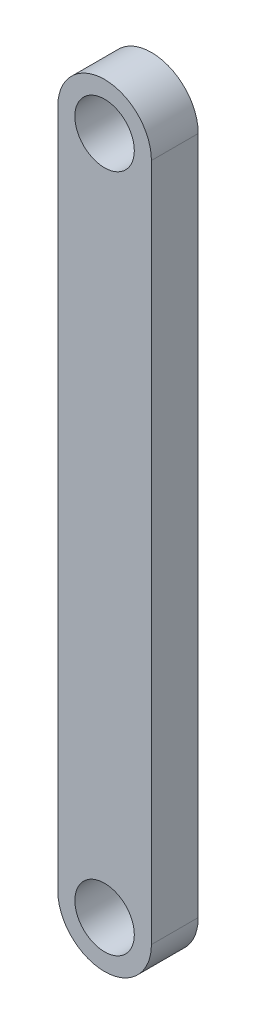
ISO-10303-21;
HEADER;
FILE_DESCRIPTION(('STEP AP214'),'2;1');
FILE_NAME('part.step','',(''),(''),'','','');
FILE_SCHEMA(('AUTOMOTIVE_DESIGN { 1 0 10303 214 1 1 1 1 }'));
ENDSEC;
DATA;
#1=APPLICATION_CONTEXT('core data for automotive mechanical design processes');
#2=APPLICATION_PROTOCOL_DEFINITION('international standard','automotive_design',2000,#1);
#3=PRODUCT_CONTEXT('',#1,'mechanical');
#4=PRODUCT('Part','Part','',(#3));
#5=PRODUCT_RELATED_PRODUCT_CATEGORY('part','',(#4));
#6=PRODUCT_DEFINITION_FORMATION('','',#4);
#7=PRODUCT_DEFINITION_CONTEXT('part definition',#1,'design');
#8=PRODUCT_DEFINITION('design','',#6,#7);
#9=PRODUCT_DEFINITION_SHAPE('','',#8);
#10=(LENGTH_UNIT() NAMED_UNIT(*) SI_UNIT(.MILLI.,.METRE.));
#11=(NAMED_UNIT(*) PLANE_ANGLE_UNIT() SI_UNIT($,.RADIAN.));
#12=(NAMED_UNIT(*) SI_UNIT($,.STERADIAN.) SOLID_ANGLE_UNIT());
#13=UNCERTAINTY_MEASURE_WITH_UNIT(LENGTH_MEASURE(1.E-05),#10,'distance_accuracy_value','');
#14=(GEOMETRIC_REPRESENTATION_CONTEXT(3) GLOBAL_UNCERTAINTY_ASSIGNED_CONTEXT((#13)) GLOBAL_UNIT_ASSIGNED_CONTEXT((#10,
#11,#12)) REPRESENTATION_CONTEXT('',''));
#15=CARTESIAN_POINT('',(0.,0.,0.));
#16=DIRECTION('',(0.,0.,1.));
#17=DIRECTION('',(1.,0.,0.));
#18=AXIS2_PLACEMENT_3D('',#15,#16,#17);
#19=CARTESIAN_POINT('',(0.,0.,10.));
#20=DIRECTION('',(0.,0.,-1.));
#21=DIRECTION('',(-1.,0.,0.));
#22=AXIS2_PLACEMENT_3D('',#19,#20,#21);
#23=CYLINDRICAL_SURFACE('',#22,10.);
#24=CARTESIAN_POINT('',(0.,0.,0.));
#25=DIRECTION('',(0.,0.,1.));
#26=DIRECTION('',(1.,0.,0.));
#27=AXIS2_PLACEMENT_3D('',#24,#25,#26);
#28=CIRCLE('',#27,10.);
#29=CARTESIAN_POINT('',(-10.,0.,0.));
#30=VERTEX_POINT('',#29);
#31=CARTESIAN_POINT('',(10.,0.,0.));
#32=VERTEX_POINT('',#31);
#33=EDGE_CURVE('E96',#30,#32,#28,.T.);
#34=ORIENTED_EDGE('',*,*,#33,.T.);
#35=DIRECTION('',(0.,0.,-1.));
#36=VECTOR('',#35,1.);
#37=CARTESIAN_POINT('',(10.,0.,10.));
#38=LINE('',#37,#36);
#39=CARTESIAN_POINT('',(10.,0.,10.));
#40=VERTEX_POINT('',#39);
#41=EDGE_CURVE('E11',#40,#32,#38,.T.);
#42=ORIENTED_EDGE('',*,*,#41,.F.);
#43=CARTESIAN_POINT('',(0.,0.,10.));
#44=DIRECTION('',(0.,0.,1.));
#45=DIRECTION('',(1.,0.,0.));
#46=AXIS2_PLACEMENT_3D('',#43,#44,#45);
#47=CIRCLE('',#46,10.);
#48=CARTESIAN_POINT('',(-10.,0.,10.));
#49=VERTEX_POINT('',#48);
#50=EDGE_CURVE('E84',#49,#40,#47,.T.);
#51=ORIENTED_EDGE('',*,*,#50,.F.);
#52=DIRECTION('',(0.,0.,-1.));
#53=VECTOR('',#52,1.);
#54=CARTESIAN_POINT('',(-10.,0.,10.));
#55=LINE('',#54,#53);
#56=EDGE_CURVE('E92',#49,#30,#55,.T.);
#57=ORIENTED_EDGE('',*,*,#56,.T.);
#58=EDGE_LOOP('',(#34,#42,#51,#57));
#59=FACE_BOUND('',#58,.T.);
#60=ADVANCED_FACE('F33',(#59),#23,.T.);
#61=CARTESIAN_POINT('',(10.,0.,10.));
#62=DIRECTION('',(-1.,0.,0.));
#63=DIRECTION('',(0.,0.,1.));
#64=AXIS2_PLACEMENT_3D('',#61,#62,#63);
#65=PLANE('',#64);
#66=DIRECTION('',(0.,1.,0.));
#67=VECTOR('',#66,1.);
#68=CARTESIAN_POINT('',(10.,0.,0.));
#69=LINE('',#68,#67);
#70=CARTESIAN_POINT('',(10.,145.,0.));
#71=VERTEX_POINT('',#70);
#72=EDGE_CURVE('E88',#32,#71,#69,.T.);
#73=ORIENTED_EDGE('',*,*,#72,.T.);
#74=DIRECTION('',(0.,0.,-1.));
#75=VECTOR('',#74,1.);
#76=CARTESIAN_POINT('',(10.,145.,10.));
#77=LINE('',#76,#75);
#78=CARTESIAN_POINT('',(10.,145.,10.));
#79=VERTEX_POINT('',#78);
#80=EDGE_CURVE('E41',#79,#71,#77,.T.);
#81=ORIENTED_EDGE('',*,*,#80,.F.);
#82=DIRECTION('',(0.,1.,0.));
#83=VECTOR('',#82,1.);
#84=CARTESIAN_POINT('',(10.,0.,10.));
#85=LINE('',#84,#83);
#86=EDGE_CURVE('E79',#40,#79,#85,.T.);
#87=ORIENTED_EDGE('',*,*,#86,.F.);
#88=ORIENTED_EDGE('',*,*,#41,.T.);
#89=EDGE_LOOP('',(#73,#81,#87,#88));
#90=FACE_BOUND('',#89,.T.);
#91=ADVANCED_FACE('F87',(#90),#65,.F.);
#92=CARTESIAN_POINT('',(0.,145.,10.));
#93=DIRECTION('',(0.,0.,-1.));
#94=DIRECTION('',(-1.,0.,0.));
#95=AXIS2_PLACEMENT_3D('',#92,#93,#94);
#96=CYLINDRICAL_SURFACE('',#95,10.);
#97=CARTESIAN_POINT('',(0.,145.,0.));
#98=DIRECTION('',(0.,0.,1.));
#99=DIRECTION('',(1.,0.,0.));
#100=AXIS2_PLACEMENT_3D('',#97,#98,#99);
#101=CIRCLE('',#100,10.);
#102=CARTESIAN_POINT('',(-10.,145.,0.));
#103=VERTEX_POINT('',#102);
#104=EDGE_CURVE('E66',#71,#103,#101,.T.);
#105=ORIENTED_EDGE('',*,*,#104,.T.);
#106=DIRECTION('',(0.,0.,-1.));
#107=VECTOR('',#106,1.);
#108=CARTESIAN_POINT('',(-10.,145.,10.));
#109=LINE('',#108,#107);
#110=CARTESIAN_POINT('',(-10.,145.,10.));
#111=VERTEX_POINT('',#110);
#112=EDGE_CURVE('E89',#111,#103,#109,.T.);
#113=ORIENTED_EDGE('',*,*,#112,.F.);
#114=CARTESIAN_POINT('',(0.,145.,10.));
#115=DIRECTION('',(0.,0.,1.));
#116=DIRECTION('',(1.,0.,0.));
#117=AXIS2_PLACEMENT_3D('',#114,#115,#116);
#118=CIRCLE('',#117,10.);
#119=EDGE_CURVE('E82',#79,#111,#118,.T.);
#120=ORIENTED_EDGE('',*,*,#119,.F.);
#121=ORIENTED_EDGE('',*,*,#80,.T.);
#122=EDGE_LOOP('',(#105,#113,#120,#121));
#123=FACE_BOUND('',#122,.T.);
#124=ADVANCED_FACE('F90',(#123),#96,.T.);
#125=CARTESIAN_POINT('',(-10.,0.,10.));
#126=DIRECTION('',(1.,0.,0.));
#127=DIRECTION('',(0.,0.,-1.));
#128=AXIS2_PLACEMENT_3D('',#125,#126,#127);
#129=PLANE('',#128);
#130=DIRECTION('',(0.,-1.,0.));
#131=VECTOR('',#130,1.);
#132=CARTESIAN_POINT('',(-10.,0.,0.));
#133=LINE('',#132,#131);
#134=EDGE_CURVE('E72',#103,#30,#133,.T.);
#135=ORIENTED_EDGE('',*,*,#134,.T.);
#136=ORIENTED_EDGE('',*,*,#56,.F.);
#137=DIRECTION('',(0.,-1.,0.));
#138=VECTOR('',#137,1.);
#139=CARTESIAN_POINT('',(-10.,0.,10.));
#140=LINE('',#139,#138);
#141=EDGE_CURVE('E49',#111,#49,#140,.T.);
#142=ORIENTED_EDGE('',*,*,#141,.F.);
#143=ORIENTED_EDGE('',*,*,#112,.T.);
#144=EDGE_LOOP('',(#135,#136,#142,#143));
#145=FACE_BOUND('',#144,.T.);
#146=ADVANCED_FACE('F104',(#145),#129,.F.);
#147=CARTESIAN_POINT('',(0.,0.,10.));
#148=DIRECTION('',(0.,0.,1.));
#149=DIRECTION('',(1.,0.,0.));
#150=AXIS2_PLACEMENT_3D('',#147,#148,#149);
#151=PLANE('',#150);
#152=CARTESIAN_POINT('',(0.,145.,10.));
#153=DIRECTION('',(0.,0.,1.));
#154=DIRECTION('',(1.,0.,0.));
#155=AXIS2_PLACEMENT_3D('',#152,#153,#154);
#156=CIRCLE('',#155,6.34999999999999);
#157=CARTESIAN_POINT('',(6.34999999999999,145.,10.));
#158=VERTEX_POINT('',#157);
#159=EDGE_CURVE('E116',#158,#158,#156,.T.);
#160=ORIENTED_EDGE('',*,*,#159,.F.);
#161=EDGE_LOOP('',(#160));
#162=FACE_BOUND('',#161,.T.);
#163=CARTESIAN_POINT('',(0.,0.,10.));
#164=DIRECTION('',(0.,0.,1.));
#165=DIRECTION('',(1.,0.,0.));
#166=AXIS2_PLACEMENT_3D('',#163,#164,#165);
#167=CIRCLE('',#166,6.35);
#168=CARTESIAN_POINT('',(6.35,0.,10.));
#169=VERTEX_POINT('',#168);
#170=EDGE_CURVE('E110',#169,#169,#167,.T.);
#171=ORIENTED_EDGE('',*,*,#170,.F.);
#172=EDGE_LOOP('',(#171));
#173=FACE_BOUND('',#172,.T.);
#174=ORIENTED_EDGE('',*,*,#50,.T.);
#175=ORIENTED_EDGE('',*,*,#86,.T.);
#176=ORIENTED_EDGE('',*,*,#119,.T.);
#177=ORIENTED_EDGE('',*,*,#141,.T.);
#178=EDGE_LOOP('',(#174,#175,#176,#177));
#179=FACE_BOUND('',#178,.T.);
#180=ADVANCED_FACE('F80',(#162,#173,#179),#151,.T.);
#181=CARTESIAN_POINT('',(0.,0.,0.));
#182=DIRECTION('',(0.,0.,1.));
#183=DIRECTION('',(1.,0.,0.));
#184=AXIS2_PLACEMENT_3D('',#181,#182,#183);
#185=PLANE('',#184);
#186=CARTESIAN_POINT('',(0.,145.,0.));
#187=DIRECTION('',(0.,0.,1.));
#188=DIRECTION('',(1.,0.,0.));
#189=AXIS2_PLACEMENT_3D('',#186,#187,#188);
#190=CIRCLE('',#189,6.34999999999999);
#191=CARTESIAN_POINT('',(6.34999999999999,145.,0.));
#192=VERTEX_POINT('',#191);
#193=EDGE_CURVE('E99',#192,#192,#190,.T.);
#194=ORIENTED_EDGE('',*,*,#193,.T.);
#195=EDGE_LOOP('',(#194));
#196=FACE_BOUND('',#195,.T.);
#197=CARTESIAN_POINT('',(0.,0.,0.));
#198=DIRECTION('',(0.,0.,1.));
#199=DIRECTION('',(1.,0.,0.));
#200=AXIS2_PLACEMENT_3D('',#197,#198,#199);
#201=CIRCLE('',#200,6.35);
#202=CARTESIAN_POINT('',(6.35,0.,0.));
#203=VERTEX_POINT('',#202);
#204=EDGE_CURVE('E113',#203,#203,#201,.T.);
#205=ORIENTED_EDGE('',*,*,#204,.T.);
#206=EDGE_LOOP('',(#205));
#207=FACE_BOUND('',#206,.T.);
#208=ORIENTED_EDGE('',*,*,#33,.F.);
#209=ORIENTED_EDGE('',*,*,#134,.F.);
#210=ORIENTED_EDGE('',*,*,#104,.F.);
#211=ORIENTED_EDGE('',*,*,#72,.F.);
#212=EDGE_LOOP('',(#208,#209,#210,#211));
#213=FACE_BOUND('',#212,.T.);
#214=ADVANCED_FACE('F107',(#196,#207,#213),#185,.F.);
#215=CARTESIAN_POINT('',(0.,0.,0.));
#216=DIRECTION('',(0.,0.,1.));
#217=DIRECTION('',(1.,0.,0.));
#218=AXIS2_PLACEMENT_3D('',#215,#216,#217);
#219=CYLINDRICAL_SURFACE('',#218,6.35);
#220=ORIENTED_EDGE('',*,*,#204,.F.);
#221=EDGE_LOOP('',(#220));
#222=FACE_BOUND('',#221,.T.);
#223=ORIENTED_EDGE('',*,*,#170,.T.);
#224=EDGE_LOOP('',(#223));
#225=FACE_BOUND('',#224,.T.);
#226=ADVANCED_FACE('F127',(#222,#225),#219,.F.);
#227=CARTESIAN_POINT('',(0.,145.,0.));
#228=DIRECTION('',(0.,0.,1.));
#229=DIRECTION('',(1.,0.,0.));
#230=AXIS2_PLACEMENT_3D('',#227,#228,#229);
#231=CYLINDRICAL_SURFACE('',#230,6.34999999999999);
#232=ORIENTED_EDGE('',*,*,#193,.F.);
#233=EDGE_LOOP('',(#232));
#234=FACE_BOUND('',#233,.T.);
#235=ORIENTED_EDGE('',*,*,#159,.T.);
#236=EDGE_LOOP('',(#235));
#237=FACE_BOUND('',#236,.T.);
#238=ADVANCED_FACE('F124',(#234,#237),#231,.F.);
#239=CLOSED_SHELL('',(#60,#91,#124,#146,#180,#214,#226,#238));
#240=MANIFOLD_SOLID_BREP('B2',#239);
#241=ADVANCED_BREP_SHAPE_REPRESENTATION('',(#18,#240),#14);
#242=SHAPE_DEFINITION_REPRESENTATION(#9,#241);
ENDSEC;
END-ISO-10303-21;
